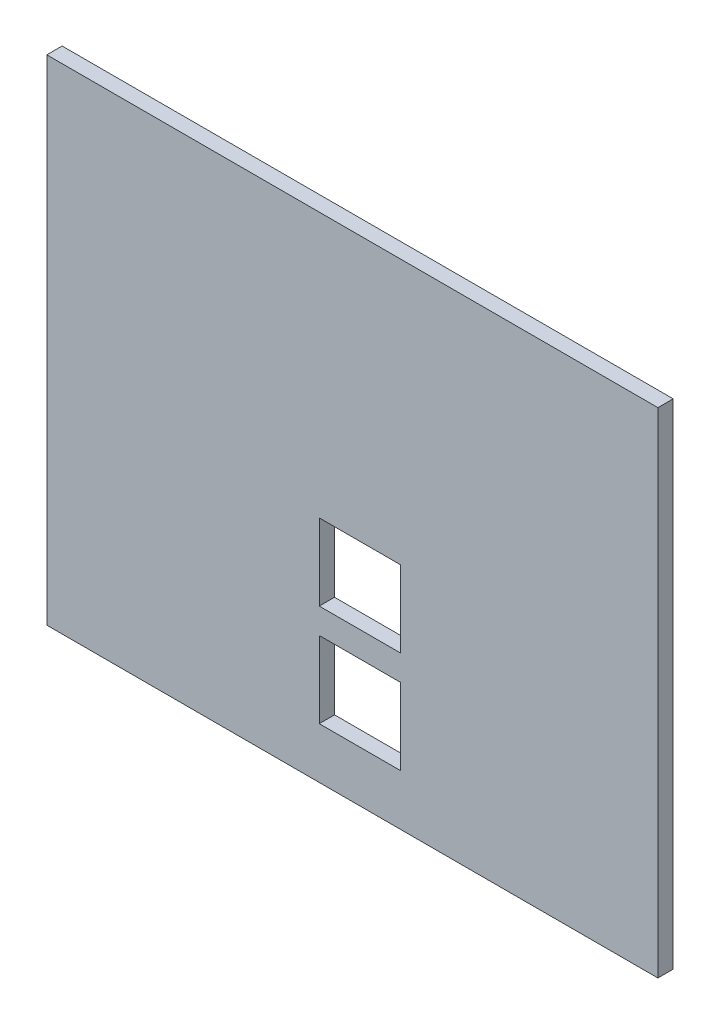
ISO-10303-21;
HEADER;
FILE_DESCRIPTION(('STEP AP214'),'2;1');
FILE_NAME('part.step','',(''),(''),'','','');
FILE_SCHEMA(('AUTOMOTIVE_DESIGN { 1 0 10303 214 1 1 1 1 }'));
ENDSEC;
DATA;
#1=APPLICATION_CONTEXT('core data for automotive mechanical design processes');
#2=APPLICATION_PROTOCOL_DEFINITION('international standard','automotive_design',2000,#1);
#3=PRODUCT_CONTEXT('',#1,'mechanical');
#4=PRODUCT('Part','Part','',(#3));
#5=PRODUCT_RELATED_PRODUCT_CATEGORY('part','',(#4));
#6=PRODUCT_DEFINITION_FORMATION('','',#4);
#7=PRODUCT_DEFINITION_CONTEXT('part definition',#1,'design');
#8=PRODUCT_DEFINITION('design','',#6,#7);
#9=PRODUCT_DEFINITION_SHAPE('','',#8);
#10=(LENGTH_UNIT() NAMED_UNIT(*) SI_UNIT(.MILLI.,.METRE.));
#11=(NAMED_UNIT(*) PLANE_ANGLE_UNIT() SI_UNIT($,.RADIAN.));
#12=(NAMED_UNIT(*) SI_UNIT($,.STERADIAN.) SOLID_ANGLE_UNIT());
#13=UNCERTAINTY_MEASURE_WITH_UNIT(LENGTH_MEASURE(1.E-05),#10,'distance_accuracy_value','');
#14=(GEOMETRIC_REPRESENTATION_CONTEXT(3) GLOBAL_UNCERTAINTY_ASSIGNED_CONTEXT((#13)) GLOBAL_UNIT_ASSIGNED_CONTEXT((#10,
#11,#12)) REPRESENTATION_CONTEXT('',''));
#15=CARTESIAN_POINT('',(0.,0.,0.));
#16=DIRECTION('',(0.,0.,1.));
#17=DIRECTION('',(1.,0.,0.));
#18=AXIS2_PLACEMENT_3D('',#15,#16,#17);
#19=CARTESIAN_POINT('',(-60.,-48.5,3.));
#20=DIRECTION('',(1.,0.,0.));
#21=DIRECTION('',(0.,0.,-1.));
#22=AXIS2_PLACEMENT_3D('',#19,#20,#21);
#23=PLANE('',#22);
#24=DIRECTION('',(0.,-1.,0.));
#25=VECTOR('',#24,1.);
#26=CARTESIAN_POINT('',(-60.,-48.5,0.));
#27=LINE('',#26,#25);
#28=CARTESIAN_POINT('',(-60.,48.5,0.));
#29=VERTEX_POINT('',#28);
#30=CARTESIAN_POINT('',(-60.,-48.5,0.));
#31=VERTEX_POINT('',#30);
#32=EDGE_CURVE('E188',#29,#31,#27,.T.);
#33=ORIENTED_EDGE('',*,*,#32,.T.);
#34=DIRECTION('',(0.,0.,-1.));
#35=VECTOR('',#34,1.);
#36=CARTESIAN_POINT('',(-60.,-48.5,3.));
#37=LINE('',#36,#35);
#38=CARTESIAN_POINT('',(-60.,-48.5,3.));
#39=VERTEX_POINT('',#38);
#40=EDGE_CURVE('E11',#39,#31,#37,.T.);
#41=ORIENTED_EDGE('',*,*,#40,.F.);
#42=DIRECTION('',(0.,-1.,0.));
#43=VECTOR('',#42,1.);
#44=CARTESIAN_POINT('',(-60.,-48.5,3.));
#45=LINE('',#44,#43);
#46=CARTESIAN_POINT('',(-60.,48.5,3.));
#47=VERTEX_POINT('',#46);
#48=EDGE_CURVE('E195',#47,#39,#45,.T.);
#49=ORIENTED_EDGE('',*,*,#48,.F.);
#50=DIRECTION('',(0.,0.,-1.));
#51=VECTOR('',#50,1.);
#52=CARTESIAN_POINT('',(-60.,48.5,3.));
#53=LINE('',#52,#51);
#54=EDGE_CURVE('E205',#47,#29,#53,.T.);
#55=ORIENTED_EDGE('',*,*,#54,.T.);
#56=EDGE_LOOP('',(#33,#41,#49,#55));
#57=FACE_BOUND('',#56,.T.);
#58=ADVANCED_FACE('F38',(#57),#23,.F.);
#59=CARTESIAN_POINT('',(60.,-48.5,3.));
#60=DIRECTION('',(0.,1.,0.));
#61=DIRECTION('',(-1.,0.,0.));
#62=AXIS2_PLACEMENT_3D('',#59,#60,#61);
#63=PLANE('',#62);
#64=DIRECTION('',(1.,0.,0.));
#65=VECTOR('',#64,1.);
#66=CARTESIAN_POINT('',(60.,-48.5,0.));
#67=LINE('',#66,#65);
#68=CARTESIAN_POINT('',(60.,-48.5,0.));
#69=VERTEX_POINT('',#68);
#70=EDGE_CURVE('E208',#31,#69,#67,.T.);
#71=ORIENTED_EDGE('',*,*,#70,.T.);
#72=DIRECTION('',(0.,0.,-1.));
#73=VECTOR('',#72,1.);
#74=CARTESIAN_POINT('',(60.,-48.5,3.));
#75=LINE('',#74,#73);
#76=CARTESIAN_POINT('',(60.,-48.5,3.));
#77=VERTEX_POINT('',#76);
#78=EDGE_CURVE('E45',#77,#69,#75,.T.);
#79=ORIENTED_EDGE('',*,*,#78,.F.);
#80=DIRECTION('',(1.,0.,0.));
#81=VECTOR('',#80,1.);
#82=CARTESIAN_POINT('',(60.,-48.5,3.));
#83=LINE('',#82,#81);
#84=EDGE_CURVE('E198',#39,#77,#83,.T.);
#85=ORIENTED_EDGE('',*,*,#84,.F.);
#86=ORIENTED_EDGE('',*,*,#40,.T.);
#87=EDGE_LOOP('',(#71,#79,#85,#86));
#88=FACE_BOUND('',#87,.T.);
#89=ADVANCED_FACE('F237',(#88),#63,.F.);
#90=CARTESIAN_POINT('',(60.,-48.5,3.));
#91=DIRECTION('',(-1.,0.,0.));
#92=DIRECTION('',(0.,0.,1.));
#93=AXIS2_PLACEMENT_3D('',#90,#91,#92);
#94=PLANE('',#93);
#95=DIRECTION('',(0.,1.,0.));
#96=VECTOR('',#95,1.);
#97=CARTESIAN_POINT('',(60.,-48.5,0.));
#98=LINE('',#97,#96);
#99=CARTESIAN_POINT('',(60.,48.5,0.));
#100=VERTEX_POINT('',#99);
#101=EDGE_CURVE('E210',#69,#100,#98,.T.);
#102=ORIENTED_EDGE('',*,*,#101,.T.);
#103=DIRECTION('',(0.,0.,-1.));
#104=VECTOR('',#103,1.);
#105=CARTESIAN_POINT('',(60.,48.5,3.));
#106=LINE('',#105,#104);
#107=CARTESIAN_POINT('',(60.,48.5,3.));
#108=VERTEX_POINT('',#107);
#109=EDGE_CURVE('E215',#108,#100,#106,.T.);
#110=ORIENTED_EDGE('',*,*,#109,.F.);
#111=DIRECTION('',(0.,1.,0.));
#112=VECTOR('',#111,1.);
#113=CARTESIAN_POINT('',(60.,-48.5,3.));
#114=LINE('',#113,#112);
#115=EDGE_CURVE('E201',#77,#108,#114,.T.);
#116=ORIENTED_EDGE('',*,*,#115,.F.);
#117=ORIENTED_EDGE('',*,*,#78,.T.);
#118=EDGE_LOOP('',(#102,#110,#116,#117));
#119=FACE_BOUND('',#118,.T.);
#120=ADVANCED_FACE('F222',(#119),#94,.F.);
#121=CARTESIAN_POINT('',(60.,48.5,3.));
#122=DIRECTION('',(0.,-1.,0.));
#123=DIRECTION('',(1.,0.,0.));
#124=AXIS2_PLACEMENT_3D('',#121,#122,#123);
#125=PLANE('',#124);
#126=DIRECTION('',(-1.,0.,0.));
#127=VECTOR('',#126,1.);
#128=CARTESIAN_POINT('',(60.,48.5,0.));
#129=LINE('',#128,#127);
#130=EDGE_CURVE('E199',#100,#29,#129,.T.);
#131=ORIENTED_EDGE('',*,*,#130,.T.);
#132=ORIENTED_EDGE('',*,*,#54,.F.);
#133=DIRECTION('',(-1.,0.,0.));
#134=VECTOR('',#133,1.);
#135=CARTESIAN_POINT('',(60.,48.5,3.));
#136=LINE('',#135,#134);
#137=EDGE_CURVE('E203',#108,#47,#136,.T.);
#138=ORIENTED_EDGE('',*,*,#137,.F.);
#139=ORIENTED_EDGE('',*,*,#109,.T.);
#140=EDGE_LOOP('',(#131,#132,#138,#139));
#141=FACE_BOUND('',#140,.T.);
#142=ADVANCED_FACE('F230',(#141),#125,.F.);
#143=CARTESIAN_POINT('',(0.,0.,3.));
#144=DIRECTION('',(0.,0.,1.));
#145=DIRECTION('',(1.,0.,0.));
#146=AXIS2_PLACEMENT_3D('',#143,#144,#145);
#147=PLANE('',#146);
#148=DIRECTION('',(0.,-1.,0.));
#149=VECTOR('',#148,1.);
#150=CARTESIAN_POINT('',(-6.50000000000003,-3.50000000000001,3.));
#151=LINE('',#150,#149);
#152=CARTESIAN_POINT('',(-6.50000000000003,-3.50000000000001,3.));
#153=VERTEX_POINT('',#152);
#154=CARTESIAN_POINT('',(-6.50000000000003,-18.5,3.));
#155=VERTEX_POINT('',#154);
#156=EDGE_CURVE('E52',#153,#155,#151,.T.);
#157=ORIENTED_EDGE('',*,*,#156,.F.);
#158=DIRECTION('',(-1.,0.,0.));
#159=VECTOR('',#158,1.);
#160=CARTESIAN_POINT('',(-6.50000000000003,-3.50000000000001,3.));
#161=LINE('',#160,#159);
#162=CARTESIAN_POINT('',(9.49999999999997,-3.50000000000001,3.));
#163=VERTEX_POINT('',#162);
#164=EDGE_CURVE('E144',#163,#153,#161,.T.);
#165=ORIENTED_EDGE('',*,*,#164,.F.);
#166=DIRECTION('',(0.,1.,0.));
#167=VECTOR('',#166,1.);
#168=CARTESIAN_POINT('',(9.49999999999997,-3.50000000000001,3.));
#169=LINE('',#168,#167);
#170=CARTESIAN_POINT('',(9.49999999999998,-18.5,3.));
#171=VERTEX_POINT('',#170);
#172=EDGE_CURVE('E147',#171,#163,#169,.T.);
#173=ORIENTED_EDGE('',*,*,#172,.F.);
#174=DIRECTION('',(1.,0.,0.));
#175=VECTOR('',#174,1.);
#176=CARTESIAN_POINT('',(-6.50000000000003,-18.5,3.));
#177=LINE('',#176,#175);
#178=EDGE_CURVE('E153',#155,#171,#177,.T.);
#179=ORIENTED_EDGE('',*,*,#178,.F.);
#180=EDGE_LOOP('',(#157,#165,#173,#179));
#181=FACE_BOUND('',#180,.T.);
#182=DIRECTION('',(0.,-1.,0.));
#183=VECTOR('',#182,1.);
#184=CARTESIAN_POINT('',(-6.50000000000003,-23.5,3.));
#185=LINE('',#184,#183);
#186=CARTESIAN_POINT('',(-6.50000000000003,-23.5,3.));
#187=VERTEX_POINT('',#186);
#188=CARTESIAN_POINT('',(-6.50000000000003,-38.5,3.));
#189=VERTEX_POINT('',#188);
#190=EDGE_CURVE('E159',#187,#189,#185,.T.);
#191=ORIENTED_EDGE('',*,*,#190,.F.);
#192=DIRECTION('',(-1.,0.,0.));
#193=VECTOR('',#192,1.);
#194=CARTESIAN_POINT('',(-6.50000000000003,-23.5,3.));
#195=LINE('',#194,#193);
#196=CARTESIAN_POINT('',(9.49999999999997,-23.5,3.));
#197=VERTEX_POINT('',#196);
#198=EDGE_CURVE('E167',#197,#187,#195,.T.);
#199=ORIENTED_EDGE('',*,*,#198,.F.);
#200=DIRECTION('',(0.,1.,0.));
#201=VECTOR('',#200,1.);
#202=CARTESIAN_POINT('',(9.49999999999997,-23.5,3.));
#203=LINE('',#202,#201);
#204=CARTESIAN_POINT('',(9.49999999999998,-38.5,3.));
#205=VERTEX_POINT('',#204);
#206=EDGE_CURVE('E181',#205,#197,#203,.T.);
#207=ORIENTED_EDGE('',*,*,#206,.F.);
#208=DIRECTION('',(1.,0.,0.));
#209=VECTOR('',#208,1.);
#210=CARTESIAN_POINT('',(-6.50000000000003,-38.5,3.));
#211=LINE('',#210,#209);
#212=EDGE_CURVE('E178',#189,#205,#211,.T.);
#213=ORIENTED_EDGE('',*,*,#212,.F.);
#214=EDGE_LOOP('',(#191,#199,#207,#213));
#215=FACE_BOUND('',#214,.T.);
#216=ORIENTED_EDGE('',*,*,#48,.T.);
#217=ORIENTED_EDGE('',*,*,#84,.T.);
#218=ORIENTED_EDGE('',*,*,#115,.T.);
#219=ORIENTED_EDGE('',*,*,#137,.T.);
#220=EDGE_LOOP('',(#216,#217,#218,#219));
#221=FACE_BOUND('',#220,.T.);
#222=ADVANCED_FACE('F236',(#181,#215,#221),#147,.T.);
#223=CARTESIAN_POINT('',(0.,0.,0.));
#224=DIRECTION('',(0.,0.,1.));
#225=DIRECTION('',(1.,0.,0.));
#226=AXIS2_PLACEMENT_3D('',#223,#224,#225);
#227=PLANE('',#226);
#228=DIRECTION('',(-1.,0.,0.));
#229=VECTOR('',#228,1.);
#230=CARTESIAN_POINT('',(-6.50000000000003,-3.50000000000001,0.));
#231=LINE('',#230,#229);
#232=CARTESIAN_POINT('',(9.49999999999997,-3.50000000000001,0.));
#233=VERTEX_POINT('',#232);
#234=CARTESIAN_POINT('',(-6.50000000000003,-3.50000000000001,0.));
#235=VERTEX_POINT('',#234);
#236=EDGE_CURVE('E134',#233,#235,#231,.T.);
#237=ORIENTED_EDGE('',*,*,#236,.T.);
#238=DIRECTION('',(0.,-1.,0.));
#239=VECTOR('',#238,1.);
#240=CARTESIAN_POINT('',(-6.50000000000003,-3.50000000000001,0.));
#241=LINE('',#240,#239);
#242=CARTESIAN_POINT('',(-6.50000000000003,-18.5,0.));
#243=VERTEX_POINT('',#242);
#244=EDGE_CURVE('E128',#235,#243,#241,.T.);
#245=ORIENTED_EDGE('',*,*,#244,.T.);
#246=DIRECTION('',(1.,0.,0.));
#247=VECTOR('',#246,1.);
#248=CARTESIAN_POINT('',(-6.50000000000003,-18.5,0.));
#249=LINE('',#248,#247);
#250=CARTESIAN_POINT('',(9.49999999999998,-18.5,0.));
#251=VERTEX_POINT('',#250);
#252=EDGE_CURVE('E137',#243,#251,#249,.T.);
#253=ORIENTED_EDGE('',*,*,#252,.T.);
#254=DIRECTION('',(0.,1.,0.));
#255=VECTOR('',#254,1.);
#256=CARTESIAN_POINT('',(9.49999999999997,-3.50000000000001,0.));
#257=LINE('',#256,#255);
#258=EDGE_CURVE('E60',#251,#233,#257,.T.);
#259=ORIENTED_EDGE('',*,*,#258,.T.);
#260=EDGE_LOOP('',(#237,#245,#253,#259));
#261=FACE_BOUND('',#260,.T.);
#262=DIRECTION('',(-1.,0.,0.));
#263=VECTOR('',#262,1.);
#264=CARTESIAN_POINT('',(-6.50000000000003,-23.5,0.));
#265=LINE('',#264,#263);
#266=CARTESIAN_POINT('',(9.49999999999997,-23.5,0.));
#267=VERTEX_POINT('',#266);
#268=CARTESIAN_POINT('',(-6.50000000000003,-23.5,0.));
#269=VERTEX_POINT('',#268);
#270=EDGE_CURVE('E173',#267,#269,#265,.T.);
#271=ORIENTED_EDGE('',*,*,#270,.T.);
#272=DIRECTION('',(0.,-1.,0.));
#273=VECTOR('',#272,1.);
#274=CARTESIAN_POINT('',(-6.50000000000003,-23.5,0.));
#275=LINE('',#274,#273);
#276=CARTESIAN_POINT('',(-6.50000000000003,-38.5,0.));
#277=VERTEX_POINT('',#276);
#278=EDGE_CURVE('E163',#269,#277,#275,.T.);
#279=ORIENTED_EDGE('',*,*,#278,.T.);
#280=DIRECTION('',(1.,0.,0.));
#281=VECTOR('',#280,1.);
#282=CARTESIAN_POINT('',(-6.50000000000003,-38.5,0.));
#283=LINE('',#282,#281);
#284=CARTESIAN_POINT('',(9.49999999999998,-38.5,0.));
#285=VERTEX_POINT('',#284);
#286=EDGE_CURVE('E166',#277,#285,#283,.T.);
#287=ORIENTED_EDGE('',*,*,#286,.T.);
#288=DIRECTION('',(0.,1.,0.));
#289=VECTOR('',#288,1.);
#290=CARTESIAN_POINT('',(9.49999999999997,-23.5,0.));
#291=LINE('',#290,#289);
#292=EDGE_CURVE('E170',#285,#267,#291,.T.);
#293=ORIENTED_EDGE('',*,*,#292,.T.);
#294=EDGE_LOOP('',(#271,#279,#287,#293));
#295=FACE_BOUND('',#294,.T.);
#296=ORIENTED_EDGE('',*,*,#32,.F.);
#297=ORIENTED_EDGE('',*,*,#130,.F.);
#298=ORIENTED_EDGE('',*,*,#101,.F.);
#299=ORIENTED_EDGE('',*,*,#70,.F.);
#300=EDGE_LOOP('',(#296,#297,#298,#299));
#301=FACE_BOUND('',#300,.T.);
#302=ADVANCED_FACE('F141',(#261,#295,#301),#227,.F.);
#303=CARTESIAN_POINT('',(-6.50000000000003,-23.5,0.));
#304=DIRECTION('',(-1.,0.,0.));
#305=DIRECTION('',(0.,-1.,0.));
#306=AXIS2_PLACEMENT_3D('',#303,#304,#305);
#307=PLANE('',#306);
#308=ORIENTED_EDGE('',*,*,#190,.T.);
#309=DIRECTION('',(0.,0.,1.));
#310=VECTOR('',#309,1.);
#311=CARTESIAN_POINT('',(-6.50000000000003,-38.5,0.));
#312=LINE('',#311,#310);
#313=EDGE_CURVE('E176',#277,#189,#312,.T.);
#314=ORIENTED_EDGE('',*,*,#313,.F.);
#315=ORIENTED_EDGE('',*,*,#278,.F.);
#316=DIRECTION('',(0.,0.,1.));
#317=VECTOR('',#316,1.);
#318=CARTESIAN_POINT('',(-6.50000000000003,-23.5,0.));
#319=LINE('',#318,#317);
#320=EDGE_CURVE('E186',#269,#187,#319,.T.);
#321=ORIENTED_EDGE('',*,*,#320,.T.);
#322=EDGE_LOOP('',(#308,#314,#315,#321));
#323=FACE_BOUND('',#322,.T.);
#324=ADVANCED_FACE('F249',(#323),#307,.F.);
#325=CARTESIAN_POINT('',(-6.50000000000003,-23.5,0.));
#326=DIRECTION('',(0.,1.,0.));
#327=DIRECTION('',(0.,0.,1.));
#328=AXIS2_PLACEMENT_3D('',#325,#326,#327);
#329=PLANE('',#328);
#330=ORIENTED_EDGE('',*,*,#198,.T.);
#331=ORIENTED_EDGE('',*,*,#320,.F.);
#332=ORIENTED_EDGE('',*,*,#270,.F.);
#333=DIRECTION('',(0.,0.,1.));
#334=VECTOR('',#333,1.);
#335=CARTESIAN_POINT('',(9.49999999999997,-23.5,0.));
#336=LINE('',#335,#334);
#337=EDGE_CURVE('E189',#267,#197,#336,.T.);
#338=ORIENTED_EDGE('',*,*,#337,.T.);
#339=EDGE_LOOP('',(#330,#331,#332,#338));
#340=FACE_BOUND('',#339,.T.);
#341=ADVANCED_FACE('F255',(#340),#329,.F.);
#342=CARTESIAN_POINT('',(9.49999999999997,-23.5,0.));
#343=DIRECTION('',(1.,0.,0.));
#344=DIRECTION('',(0.,1.,0.));
#345=AXIS2_PLACEMENT_3D('',#342,#343,#344);
#346=PLANE('',#345);
#347=ORIENTED_EDGE('',*,*,#206,.T.);
#348=ORIENTED_EDGE('',*,*,#337,.F.);
#349=ORIENTED_EDGE('',*,*,#292,.F.);
#350=DIRECTION('',(0.,0.,1.));
#351=VECTOR('',#350,1.);
#352=CARTESIAN_POINT('',(9.49999999999998,-38.5,0.));
#353=LINE('',#352,#351);
#354=EDGE_CURVE('E191',#285,#205,#353,.T.);
#355=ORIENTED_EDGE('',*,*,#354,.T.);
#356=EDGE_LOOP('',(#347,#348,#349,#355));
#357=FACE_BOUND('',#356,.T.);
#358=ADVANCED_FACE('F260',(#357),#346,.F.);
#359=CARTESIAN_POINT('',(-6.50000000000003,-38.5,0.));
#360=DIRECTION('',(0.,-1.,0.));
#361=DIRECTION('',(0.,0.,-1.));
#362=AXIS2_PLACEMENT_3D('',#359,#360,#361);
#363=PLANE('',#362);
#364=ORIENTED_EDGE('',*,*,#212,.T.);
#365=ORIENTED_EDGE('',*,*,#354,.F.);
#366=ORIENTED_EDGE('',*,*,#286,.F.);
#367=ORIENTED_EDGE('',*,*,#313,.T.);
#368=EDGE_LOOP('',(#364,#365,#366,#367));
#369=FACE_BOUND('',#368,.T.);
#370=ADVANCED_FACE('F257',(#369),#363,.F.);
#371=CARTESIAN_POINT('',(-6.50000000000003,-3.50000000000001,0.));
#372=DIRECTION('',(-1.,0.,0.));
#373=DIRECTION('',(0.,-1.,0.));
#374=AXIS2_PLACEMENT_3D('',#371,#372,#373);
#375=PLANE('',#374);
#376=ORIENTED_EDGE('',*,*,#156,.T.);
#377=DIRECTION('',(0.,0.,1.));
#378=VECTOR('',#377,1.);
#379=CARTESIAN_POINT('',(-6.50000000000003,-18.5,0.));
#380=LINE('',#379,#378);
#381=EDGE_CURVE('E124',#243,#155,#380,.T.);
#382=ORIENTED_EDGE('',*,*,#381,.F.);
#383=ORIENTED_EDGE('',*,*,#244,.F.);
#384=DIRECTION('',(0.,0.,1.));
#385=VECTOR('',#384,1.);
#386=CARTESIAN_POINT('',(-6.50000000000003,-3.50000000000001,0.));
#387=LINE('',#386,#385);
#388=EDGE_CURVE('E157',#235,#153,#387,.T.);
#389=ORIENTED_EDGE('',*,*,#388,.T.);
#390=EDGE_LOOP('',(#376,#382,#383,#389));
#391=FACE_BOUND('',#390,.T.);
#392=ADVANCED_FACE('F126',(#391),#375,.F.);
#393=CARTESIAN_POINT('',(-6.50000000000003,-3.50000000000001,0.));
#394=DIRECTION('',(0.,1.,0.));
#395=DIRECTION('',(0.,0.,1.));
#396=AXIS2_PLACEMENT_3D('',#393,#394,#395);
#397=PLANE('',#396);
#398=ORIENTED_EDGE('',*,*,#164,.T.);
#399=ORIENTED_EDGE('',*,*,#388,.F.);
#400=ORIENTED_EDGE('',*,*,#236,.F.);
#401=DIRECTION('',(0.,0.,1.));
#402=VECTOR('',#401,1.);
#403=CARTESIAN_POINT('',(9.49999999999997,-3.50000000000001,0.));
#404=LINE('',#403,#402);
#405=EDGE_CURVE('E160',#233,#163,#404,.T.);
#406=ORIENTED_EDGE('',*,*,#405,.T.);
#407=EDGE_LOOP('',(#398,#399,#400,#406));
#408=FACE_BOUND('',#407,.T.);
#409=ADVANCED_FACE('F270',(#408),#397,.F.);
#410=CARTESIAN_POINT('',(9.49999999999997,-3.50000000000001,0.));
#411=DIRECTION('',(1.,0.,0.));
#412=DIRECTION('',(0.,1.,0.));
#413=AXIS2_PLACEMENT_3D('',#410,#411,#412);
#414=PLANE('',#413);
#415=ORIENTED_EDGE('',*,*,#172,.T.);
#416=ORIENTED_EDGE('',*,*,#405,.F.);
#417=ORIENTED_EDGE('',*,*,#258,.F.);
#418=DIRECTION('',(0.,0.,1.));
#419=VECTOR('',#418,1.);
#420=CARTESIAN_POINT('',(9.49999999999998,-18.5,0.));
#421=LINE('',#420,#419);
#422=EDGE_CURVE('E133',#251,#171,#421,.T.);
#423=ORIENTED_EDGE('',*,*,#422,.T.);
#424=EDGE_LOOP('',(#415,#416,#417,#423));
#425=FACE_BOUND('',#424,.T.);
#426=ADVANCED_FACE('F273',(#425),#414,.F.);
#427=CARTESIAN_POINT('',(-6.50000000000003,-18.5,0.));
#428=DIRECTION('',(0.,-1.,0.));
#429=DIRECTION('',(0.,0.,-1.));
#430=AXIS2_PLACEMENT_3D('',#427,#428,#429);
#431=PLANE('',#430);
#432=ORIENTED_EDGE('',*,*,#178,.T.);
#433=ORIENTED_EDGE('',*,*,#422,.F.);
#434=ORIENTED_EDGE('',*,*,#252,.F.);
#435=ORIENTED_EDGE('',*,*,#381,.T.);
#436=EDGE_LOOP('',(#432,#433,#434,#435));
#437=FACE_BOUND('',#436,.T.);
#438=ADVANCED_FACE('F138',(#437),#431,.F.);
#439=CLOSED_SHELL('',(#58,#89,#120,#142,#222,#302,#324,#341,#358,#370,#392,#409,#426,#438));
#440=MANIFOLD_SOLID_BREP('B2',#439);
#441=ADVANCED_BREP_SHAPE_REPRESENTATION('',(#18,#440),#14);
#442=SHAPE_DEFINITION_REPRESENTATION(#9,#441);
ENDSEC;
END-ISO-10303-21;
